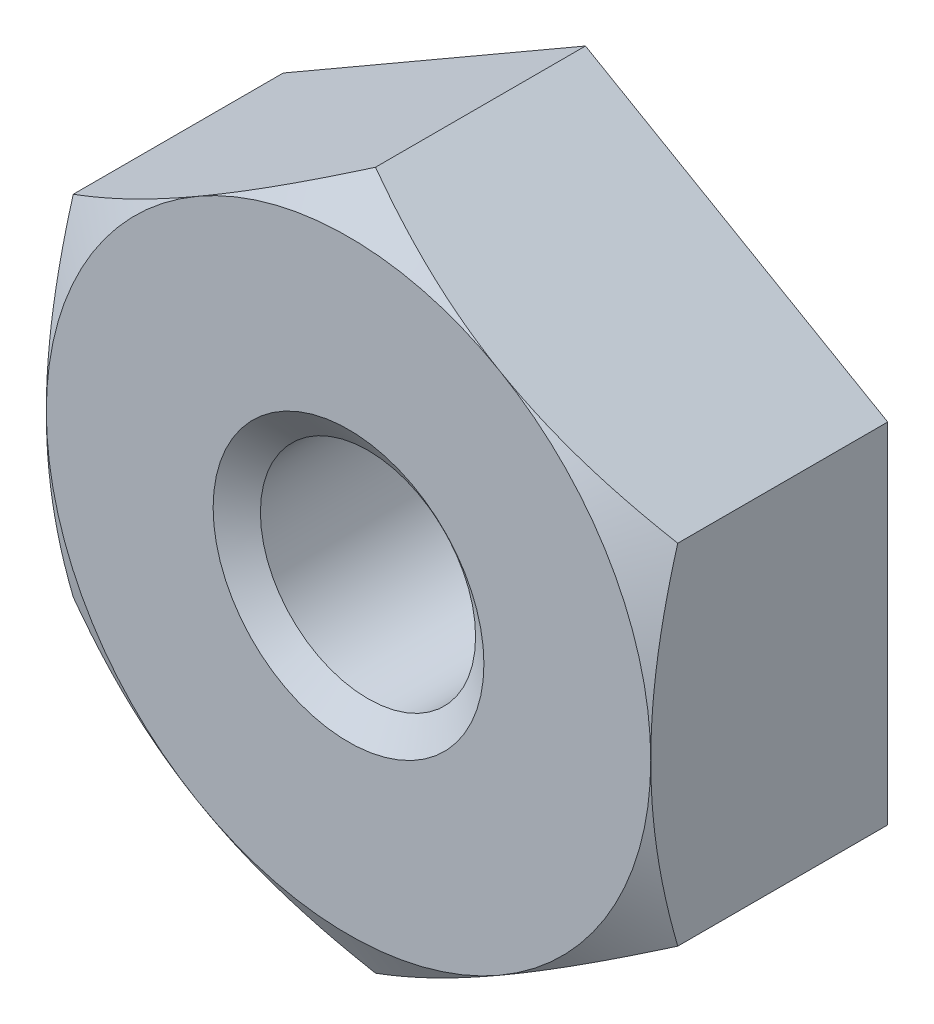
ISO-10303-21;
HEADER;
FILE_DESCRIPTION(('STEP AP214'),'2;1');
FILE_NAME('part.step','',(''),(''),'','','');
FILE_SCHEMA(('AUTOMOTIVE_DESIGN { 1 0 10303 214 1 1 1 1 }'));
ENDSEC;
DATA;
#1=APPLICATION_CONTEXT('core data for automotive mechanical design processes');
#2=APPLICATION_PROTOCOL_DEFINITION('international standard','automotive_design',2000,#1);
#3=PRODUCT_CONTEXT('',#1,'mechanical');
#4=PRODUCT('Part','Part','',(#3));
#5=PRODUCT_RELATED_PRODUCT_CATEGORY('part','',(#4));
#6=PRODUCT_DEFINITION_FORMATION('','',#4);
#7=PRODUCT_DEFINITION_CONTEXT('part definition',#1,'design');
#8=PRODUCT_DEFINITION('design','',#6,#7);
#9=PRODUCT_DEFINITION_SHAPE('','',#8);
#10=(LENGTH_UNIT() NAMED_UNIT(*) SI_UNIT(.MILLI.,.METRE.));
#11=(NAMED_UNIT(*) PLANE_ANGLE_UNIT() SI_UNIT($,.RADIAN.));
#12=(NAMED_UNIT(*) SI_UNIT($,.STERADIAN.) SOLID_ANGLE_UNIT());
#13=UNCERTAINTY_MEASURE_WITH_UNIT(LENGTH_MEASURE(1.E-05),#10,'distance_accuracy_value','');
#14=(GEOMETRIC_REPRESENTATION_CONTEXT(3) GLOBAL_UNCERTAINTY_ASSIGNED_CONTEXT((#13)) GLOBAL_UNIT_ASSIGNED_CONTEXT((#10,
#11,#12)) REPRESENTATION_CONTEXT('',''));
#15=CARTESIAN_POINT('',(0.,0.,0.));
#16=DIRECTION('',(0.,0.,1.));
#17=DIRECTION('',(1.,0.,0.));
#18=AXIS2_PLACEMENT_3D('',#15,#16,#17);
#19=CARTESIAN_POINT('',(0.,0.,-2.4892));
#20=DIRECTION('',(0.,0.,1.));
#21=DIRECTION('',(1.,0.,0.));
#22=AXIS2_PLACEMENT_3D('',#19,#20,#21);
#23=CYLINDRICAL_SURFACE('',#22,1.1303);
#24=CARTESIAN_POINT('',(0.,0.,-0.204530621911059));
#25=DIRECTION('',(0.,0.,1.));
#26=DIRECTION('',(1.,0.,0.));
#27=AXIS2_PLACEMENT_3D('',#24,#25,#26);
#28=CIRCLE('',#27,1.1303);
#29=CARTESIAN_POINT('',(1.1303,0.,-0.204530621911059));
#30=VERTEX_POINT('',#29);
#31=EDGE_CURVE('E131',#30,#30,#28,.F.);
#32=ORIENTED_EDGE('',*,*,#31,.F.);
#33=EDGE_LOOP('',(#32));
#34=FACE_BOUND('',#33,.T.);
#35=CARTESIAN_POINT('',(0.,0.,-2.25926937808894));
#36=DIRECTION('',(0.,0.,-1.));
#37=DIRECTION('',(-1.,0.,0.));
#38=AXIS2_PLACEMENT_3D('',#35,#36,#37);
#39=CIRCLE('',#38,1.1303);
#40=CARTESIAN_POINT('',(-1.1303,0.,-2.25926937808894));
#41=VERTEX_POINT('',#40);
#42=EDGE_CURVE('E37',#41,#41,#39,.F.);
#43=ORIENTED_EDGE('',*,*,#42,.F.);
#44=EDGE_LOOP('',(#43));
#45=FACE_BOUND('',#44,.T.);
#46=ADVANCED_FACE('F32',(#34,#45),#23,.F.);
#47=CARTESIAN_POINT('',(0.,3.66617420935413,-2.4892));
#48=DIRECTION('',(0.,0.,-1.));
#49=DIRECTION('',(-1.,0.,0.));
#50=AXIS2_PLACEMENT_3D('',#47,#48,#49);
#51=PLANE('',#50);
#52=DIRECTION('',(-0.866025403784437,-0.500000000000002,0.));
#53=VECTOR('',#52,1.);
#54=CARTESIAN_POINT('',(0.,3.66617420935413,-2.4892));
#55=LINE('',#54,#53);
#56=CARTESIAN_POINT('',(0.,3.66617420935413,-2.4892));
#57=VERTEX_POINT('',#56);
#58=CARTESIAN_POINT('',(-3.175,1.83308710467706,-2.4892));
#59=VERTEX_POINT('',#58);
#60=EDGE_CURVE('E258',#57,#59,#55,.T.);
#61=ORIENTED_EDGE('',*,*,#60,.F.);
#62=DIRECTION('',(-0.866025403784438,0.500000000000001,0.));
#63=VECTOR('',#62,1.);
#64=CARTESIAN_POINT('',(3.175,1.83308710467706,-2.4892));
#65=LINE('',#64,#63);
#66=CARTESIAN_POINT('',(3.175,1.83308710467706,-2.4892));
#67=VERTEX_POINT('',#66);
#68=EDGE_CURVE('E235',#67,#57,#65,.T.);
#69=ORIENTED_EDGE('',*,*,#68,.F.);
#70=DIRECTION('',(0.,-1.,0.));
#71=VECTOR('',#70,1.);
#72=CARTESIAN_POINT('',(3.175,1.83308710467706,-2.4892));
#73=LINE('',#72,#71);
#74=CARTESIAN_POINT('',(3.175,-1.83308710467707,-2.4892));
#75=VERTEX_POINT('',#74);
#76=EDGE_CURVE('E247',#67,#75,#73,.T.);
#77=ORIENTED_EDGE('',*,*,#76,.T.);
#78=DIRECTION('',(0.866025403784438,0.500000000000002,0.));
#79=VECTOR('',#78,1.);
#80=CARTESIAN_POINT('',(0.,-3.66617420935414,-2.4892));
#81=LINE('',#80,#79);
#82=CARTESIAN_POINT('',(0.,-3.66617420935414,-2.4892));
#83=VERTEX_POINT('',#82);
#84=EDGE_CURVE('E249',#83,#75,#81,.T.);
#85=ORIENTED_EDGE('',*,*,#84,.F.);
#86=DIRECTION('',(0.866025403784438,-0.500000000000001,0.));
#87=VECTOR('',#86,1.);
#88=CARTESIAN_POINT('',(-3.175,-1.83308710467707,-2.4892));
#89=LINE('',#88,#87);
#90=CARTESIAN_POINT('',(-3.175,-1.83308710467707,-2.4892));
#91=VERTEX_POINT('',#90);
#92=EDGE_CURVE('E252',#91,#83,#89,.T.);
#93=ORIENTED_EDGE('',*,*,#92,.F.);
#94=DIRECTION('',(0.,-1.,0.));
#95=VECTOR('',#94,1.);
#96=CARTESIAN_POINT('',(-3.175,1.83308710467706,-2.4892));
#97=LINE('',#96,#95);
#98=EDGE_CURVE('E255',#59,#91,#97,.T.);
#99=ORIENTED_EDGE('',*,*,#98,.F.);
#100=EDGE_LOOP('',(#61,#69,#77,#85,#93,#99));
#101=FACE_BOUND('',#100,.T.);
#102=CARTESIAN_POINT('',(0.,0.,-2.4892));
#103=DIRECTION('',(0.,0.,-1.));
#104=DIRECTION('',(-1.,0.,0.));
#105=AXIS2_PLACEMENT_3D('',#102,#103,#104);
#106=CIRCLE('',#105,1.4224);
#107=CARTESIAN_POINT('',(-1.4224,0.,-2.4892));
#108=VERTEX_POINT('',#107);
#109=EDGE_CURVE('E219',#108,#108,#106,.F.);
#110=ORIENTED_EDGE('',*,*,#109,.T.);
#111=EDGE_LOOP('',(#110));
#112=FACE_BOUND('',#111,.T.);
#113=ADVANCED_FACE('F206',(#101,#112),#51,.T.);
#114=CARTESIAN_POINT('',(0.,3.66617420935413,0.));
#115=DIRECTION('',(0.,0.,-1.));
#116=DIRECTION('',(-1.,0.,0.));
#117=AXIS2_PLACEMENT_3D('',#114,#115,#116);
#118=PLANE('',#117);
#119=CARTESIAN_POINT('',(0.,0.,0.));
#120=DIRECTION('',(0.,0.,-1.));
#121=DIRECTION('',(-1.,0.,0.));
#122=AXIS2_PLACEMENT_3D('',#119,#120,#121);
#123=CIRCLE('',#122,3.175);
#124=CARTESIAN_POINT('',(-1.58750000000001,2.74963065701559,0.));
#125=VERTEX_POINT('',#124);
#126=CARTESIAN_POINT('',(-3.175,0.,0.));
#127=VERTEX_POINT('',#126);
#128=EDGE_CURVE('E44',#125,#127,#123,.F.);
#129=ORIENTED_EDGE('',*,*,#128,.T.);
#130=CARTESIAN_POINT('',(-1.5875,-2.74963065701559,0.));
#131=VERTEX_POINT('',#130);
#132=EDGE_CURVE('E11',#127,#131,#123,.F.);
#133=ORIENTED_EDGE('',*,*,#132,.T.);
#134=CARTESIAN_POINT('',(1.58750000000001,-2.74963065701559,0.));
#135=VERTEX_POINT('',#134);
#136=EDGE_CURVE('E42',#131,#135,#123,.F.);
#137=ORIENTED_EDGE('',*,*,#136,.T.);
#138=CARTESIAN_POINT('',(3.175,0.,0.));
#139=VERTEX_POINT('',#138);
#140=EDGE_CURVE('E110',#135,#139,#123,.F.);
#141=ORIENTED_EDGE('',*,*,#140,.T.);
#142=CARTESIAN_POINT('',(0.,0.,0.));
#143=DIRECTION('',(0.,0.,1.));
#144=DIRECTION('',(1.,0.,0.));
#145=AXIS2_PLACEMENT_3D('',#142,#143,#144);
#146=CIRCLE('',#145,3.175);
#147=CARTESIAN_POINT('',(1.5875,2.74963065701559,0.));
#148=VERTEX_POINT('',#147);
#149=EDGE_CURVE('E122',#139,#148,#146,.T.);
#150=ORIENTED_EDGE('',*,*,#149,.T.);
#151=EDGE_CURVE('E137',#148,#125,#123,.F.);
#152=ORIENTED_EDGE('',*,*,#151,.T.);
#153=EDGE_LOOP('',(#129,#133,#137,#141,#150,#152));
#154=FACE_BOUND('',#153,.T.);
#155=CARTESIAN_POINT('',(0.,0.,0.));
#156=DIRECTION('',(0.,0.,1.));
#157=DIRECTION('',(1.,0.,0.));
#158=AXIS2_PLACEMENT_3D('',#155,#156,#157);
#159=CIRCLE('',#158,1.4224);
#160=CARTESIAN_POINT('',(1.4224,0.,0.));
#161=VERTEX_POINT('',#160);
#162=EDGE_CURVE('E218',#161,#161,#159,.T.);
#163=ORIENTED_EDGE('',*,*,#162,.F.);
#164=EDGE_LOOP('',(#163));
#165=FACE_BOUND('',#164,.T.);
#166=ADVANCED_FACE('F134',(#154,#165),#118,.F.);
#167=CARTESIAN_POINT('',(0.,3.66617420935413,-2.4892));
#168=DIRECTION('',(-0.500000000000002,0.866025403784438,0.));
#169=DIRECTION('',(-0.866025403784438,-0.500000000000002,0.));
#170=AXIS2_PLACEMENT_3D('',#167,#168,#169);
#171=PLANE('',#170);
#172=DIRECTION('',(0.,0.,1.));
#173=VECTOR('',#172,1.);
#174=CARTESIAN_POINT('',(-3.175,1.83308710467706,-2.4892));
#175=LINE('',#174,#173);
#176=CARTESIAN_POINT('',(-3.175,1.83308710467706,-0.283579561989607));
#177=VERTEX_POINT('',#176);
#178=EDGE_CURVE('E231',#59,#177,#175,.T.);
#179=ORIENTED_EDGE('',*,*,#178,.T.);
#180=CARTESIAN_POINT('',(-3.1752,1.83297163462322,-0.283646231805778));
#181=CARTESIAN_POINT('',(-3.03567460326018,1.91352665998974,-0.237119934023207));
#182=CARTESIAN_POINT('',(-2.89494483272887,1.99477703088899,-0.194805864908322));
#183=CARTESIAN_POINT('',(-2.61104837470026,2.15868472735379,-0.120946008708286));
#184=CARTESIAN_POINT('',(-2.46787664251628,2.24134496547055,-0.0894263509090421));
#185=CARTESIAN_POINT('',(-2.18330753500983,2.40564101629246,-0.0403611049832709));
#186=CARTESIAN_POINT('',(-2.0419539457708,2.48725154909053,-0.0224889669031262));
#187=CARTESIAN_POINT('',(-1.75858160224329,2.65085664790703,-0.00115281403229686));
#188=CARTESIAN_POINT('',(-1.61656387803407,2.73285061920892,0.00232886836810175));
#189=CARTESIAN_POINT('',(-1.35119263453263,2.88606277807967,-0.00491170072221306));
#190=CARTESIAN_POINT('',(-1.22779940341379,2.95730389328231,-0.013856146143631));
#191=CARTESIAN_POINT('',(-0.981816852669883,3.09932198517026,-0.0422055763684445));
#192=CARTESIAN_POINT('',(-0.859228383940737,3.17009847059057,-0.0616202467099069));
#193=CARTESIAN_POINT('',(-0.612738605574497,3.31240941048281,-0.110155730811223));
#194=CARTESIAN_POINT('',(-0.488868495421441,3.38392585192423,-0.139482298472806));
#195=CARTESIAN_POINT('',(-0.242975839646995,3.52589204292736,-0.20604219366216));
#196=CARTESIAN_POINT('',(-0.120950143425913,3.59634361148865,-0.243259880449916));
#197=CARTESIAN_POINT('',(0.000199999999999186,3.66628967940796,-0.283646231805781));
#198=B_SPLINE_CURVE_WITH_KNOTS('',3,(#180,#181,#182,#183,#184,#185,#186,#187,#188,#189,#190,
#191,#192,#193,#194,#195,#196,#197),.UNSPECIFIED.,.F.,.F.,(4,2,2,2,2,2,2,2,4),(0.,
0.503278731073368,1.00776724301492,1.49976968502821,1.99116790059651,2.41904879402149,
2.84732618162394,3.28510386250597,3.72202181665389),.UNSPECIFIED.);
#199=EDGE_CURVE('E56',#177,#125,#198,.T.);
#200=ORIENTED_EDGE('',*,*,#199,.T.);
#201=CARTESIAN_POINT('',(0.,3.66617420935413,-0.283579561989607));
#202=VERTEX_POINT('',#201);
#203=EDGE_CURVE('E145',#125,#202,#198,.T.);
#204=ORIENTED_EDGE('',*,*,#203,.T.);
#205=DIRECTION('',(0.,0.,1.));
#206=VECTOR('',#205,1.);
#207=CARTESIAN_POINT('',(0.,3.66617420935413,-2.4892));
#208=LINE('',#207,#206);
#209=EDGE_CURVE('E230',#57,#202,#208,.T.);
#210=ORIENTED_EDGE('',*,*,#209,.F.);
#211=ORIENTED_EDGE('',*,*,#60,.T.);
#212=EDGE_LOOP('',(#179,#200,#204,#210,#211));
#213=FACE_BOUND('',#212,.T.);
#214=ADVANCED_FACE('F34',(#213),#171,.T.);
#215=CARTESIAN_POINT('',(3.175,1.83308710467706,-2.4892));
#216=DIRECTION('',(0.500000000000001,0.866025403784438,0.));
#217=DIRECTION('',(-0.866025403784438,0.500000000000001,0.));
#218=AXIS2_PLACEMENT_3D('',#215,#216,#217);
#219=PLANE('',#218);
#220=ORIENTED_EDGE('',*,*,#209,.T.);
#221=CARTESIAN_POINT('',(-0.000200000000001121,3.66628967940796,-0.283646231805781));
#222=CARTESIAN_POINT('',(0.139325396739818,3.58573465404144,-0.23711993402321));
#223=CARTESIAN_POINT('',(0.280055167271128,3.50448428314219,-0.194805864908325));
#224=CARTESIAN_POINT('',(0.563951625299741,3.34057658667739,-0.120946008708289));
#225=CARTESIAN_POINT('',(0.707123357483717,3.25791634856063,-0.0894263509090441));
#226=CARTESIAN_POINT('',(0.991692464990167,3.09362029773873,-0.0403611049832722));
#227=CARTESIAN_POINT('',(1.1330460542292,3.01200976494065,-0.0224889669031271));
#228=CARTESIAN_POINT('',(1.41641839775671,2.84840466612415,-0.00115281403229733));
#229=CARTESIAN_POINT('',(1.55843612196593,2.76641069482226,0.0023288683681013));
#230=CARTESIAN_POINT('',(1.82380736546737,2.61319853595151,-0.00491170072221313));
#231=CARTESIAN_POINT('',(1.94720059658621,2.54195742074887,-0.0138561461436307));
#232=CARTESIAN_POINT('',(2.19318314733012,2.39993932886093,-0.0422055763684437));
#233=CARTESIAN_POINT('',(2.31577161605926,2.32916284344061,-0.0616202467099058));
#234=CARTESIAN_POINT('',(2.5622613944255,2.18685190354837,-0.110155730811222));
#235=CARTESIAN_POINT('',(2.68613150457856,2.11533546210696,-0.139482298472804));
#236=CARTESIAN_POINT('',(2.93202416035301,1.97336927110383,-0.206042193662158));
#237=CARTESIAN_POINT('',(3.05404985657409,1.90291770254253,-0.243259880449914));
#238=CARTESIAN_POINT('',(3.1752,1.83297163462322,-0.283646231805778));
#239=B_SPLINE_CURVE_WITH_KNOTS('',3,(#221,#222,#223,#224,#225,#226,#227,#228,#229,#230,#231,
#232,#233,#234,#235,#236,#237,#238),.UNSPECIFIED.,.F.,.F.,(4,2,2,2,2,2,2,2,4),(0.,
0.503278731073369,1.00776724301492,1.49976968502821,1.99116790059651,2.41904879402149,
2.84732618162394,3.28510386250597,3.72202181665389),.UNSPECIFIED.);
#240=EDGE_CURVE('E142',#202,#148,#239,.T.);
#241=ORIENTED_EDGE('',*,*,#240,.T.);
#242=CARTESIAN_POINT('',(3.175,1.83308710467707,-0.283579561989607));
#243=VERTEX_POINT('',#242);
#244=EDGE_CURVE('E125',#148,#243,#239,.T.);
#245=ORIENTED_EDGE('',*,*,#244,.T.);
#246=DIRECTION('',(0.,0.,1.));
#247=VECTOR('',#246,1.);
#248=CARTESIAN_POINT('',(3.175,1.83308710467706,-2.4892));
#249=LINE('',#248,#247);
#250=EDGE_CURVE('E141',#67,#243,#249,.T.);
#251=ORIENTED_EDGE('',*,*,#250,.F.);
#252=ORIENTED_EDGE('',*,*,#68,.T.);
#253=EDGE_LOOP('',(#220,#241,#245,#251,#252));
#254=FACE_BOUND('',#253,.T.);
#255=ADVANCED_FACE('F263',(#254),#219,.T.);
#256=CARTESIAN_POINT('',(3.175,1.83308710467706,-2.4892));
#257=DIRECTION('',(-1.,0.,0.));
#258=DIRECTION('',(0.,0.,1.));
#259=AXIS2_PLACEMENT_3D('',#256,#257,#258);
#260=PLANE('',#259);
#261=CARTESIAN_POINT('',(3.175,-4.8616171420299,-1.51932228935976));
#262=CARTESIAN_POINT('',(3.175,-4.7222166877445,-1.45195628992123));
#263=CARTESIAN_POINT('',(3.175,-4.58248664475634,-1.38525996427212));
#264=CARTESIAN_POINT('',(3.175,-4.30218917292502,-1.25358933527025));
#265=CARTESIAN_POINT('',(3.175,-4.16162160419068,-1.18861533006649));
#266=CARTESIAN_POINT('',(3.175,-3.87871153776028,-1.06042973005273));
#267=CARTESIAN_POINT('',(3.175,-3.73636348618431,-0.997230348581289));
#268=CARTESIAN_POINT('',(3.175,-3.4504974070564,-0.873546152177363));
#269=CARTESIAN_POINT('',(3.175,-3.30697944095183,-0.813061195746994));
#270=CARTESIAN_POINT('',(3.175,-3.01676360978826,-0.694809578750527));
#271=CARTESIAN_POINT('',(3.175,-2.87004833678074,-0.637085406846329));
#272=CARTESIAN_POINT('',(3.175,-2.57488727143506,-0.526158008324041));
#273=CARTESIAN_POINT('',(3.175,-2.42644128864792,-0.472955284693414));
#274=CARTESIAN_POINT('',(3.175,-2.12788752613931,-0.372500325317014));
#275=CARTESIAN_POINT('',(3.175,-1.97778404697074,-0.325235438859672));
#276=CARTESIAN_POINT('',(3.175,-1.67544317117207,-0.238191164257203));
#277=CARTESIAN_POINT('',(3.175,-1.52320646578688,-0.198409408930923));
#278=CARTESIAN_POINT('',(3.175,-1.21649515954196,-0.128262693494771));
#279=CARTESIAN_POINT('',(3.175,-1.06201997425122,-0.0979002407280043));
#280=CARTESIAN_POINT('',(3.175,-0.751207163661342,-0.0486364247633605));
#281=CARTESIAN_POINT('',(3.175,-0.594869536715697,-0.0297350716985363));
#282=CARTESIAN_POINT('',(3.175,-0.282140016767181,-0.00506556418736515));
#283=CARTESIAN_POINT('',(3.175,-0.125754853180873,0.000785733729076548));
#284=CARTESIAN_POINT('',(3.175,0.186905967950927,-0.00095572768499411));
#285=CARTESIAN_POINT('',(3.175,0.343181643385311,-0.00854499720968487));
#286=CARTESIAN_POINT('',(3.175,0.610045004210252,-0.0324474955995379));
#287=CARTESIAN_POINT('',(3.175,0.720927103340567,-0.0456480037348537));
#288=CARTESIAN_POINT('',(3.175,0.941834770691507,-0.0779568944626868));
#289=CARTESIAN_POINT('',(3.175,1.05186020102054,-0.097066208790142));
#290=CARTESIAN_POINT('',(3.175,1.38056179828294,-0.162254462566746));
#291=CARTESIAN_POINT('',(3.175,1.59769723107173,-0.216176928599965));
#292=CARTESIAN_POINT('',(3.175,1.92260738330278,-0.30917861020803));
#293=CARTESIAN_POINT('',(3.175,2.03207569486971,-0.342672941312986));
#294=CARTESIAN_POINT('',(3.175,2.24986976286739,-0.412975885555787));
#295=CARTESIAN_POINT('',(3.175,2.35819625057448,-0.449782212723362));
#296=CARTESIAN_POINT('',(3.175,2.57325368409845,-0.525943273724352));
#297=CARTESIAN_POINT('',(3.175,2.67999017870302,-0.565282497316841));
#298=CARTESIAN_POINT('',(3.175,2.89263503540125,-0.64626994332137));
#299=CARTESIAN_POINT('',(3.175,2.99854304277513,-0.687919098952175));
#300=CARTESIAN_POINT('',(3.175,3.1040681107068,-0.730495273942548));
#301=B_SPLINE_CURVE_WITH_KNOTS('',3,(#261,#262,#263,#264,#265,#266,#267,#268,#269,#270,#271,
#272,#273,#274,#275,#276,#277,#278,#279,#280,#281,#282,#283,#284,#285,#286,#287,#288,#289,#290,
#291,#292,#293,#294,#295,#296,#297,#298,#299,#300),.UNSPECIFIED.,.F.,.F.,(4,2,2,2,2,2,2,2,2,2,2,
2,2,2,2,2,2,2,2,4),(0.,0.464480110322491,0.929040108038169,1.39625859500254,1.86345269838581,
2.33638249541753,2.80936483473485,3.28132173853721,3.7531290935448,4.22506193235102,
4.69699518840458,5.16591300646642,5.63470908917535,5.96954086780258,6.30442547160104,
6.97469308766865,7.31809942506291,7.66127053211061,8.00251004161233,8.34388843151022),.UNSPECIFIED.);
#302=CARTESIAN_POINT('',(3.175,-1.83308710467707,-0.283579561989607));
#303=VERTEX_POINT('',#302);
#304=EDGE_CURVE('E106',#303,#139,#301,.T.);
#305=ORIENTED_EDGE('',*,*,#304,.F.);
#306=DIRECTION('',(0.,0.,1.));
#307=VECTOR('',#306,1.);
#308=CARTESIAN_POINT('',(3.175,-1.83308710467707,-2.4892));
#309=LINE('',#308,#307);
#310=EDGE_CURVE('E240',#75,#303,#309,.T.);
#311=ORIENTED_EDGE('',*,*,#310,.F.);
#312=ORIENTED_EDGE('',*,*,#76,.F.);
#313=ORIENTED_EDGE('',*,*,#250,.T.);
#314=EDGE_CURVE('E119',#139,#243,#301,.T.);
#315=ORIENTED_EDGE('',*,*,#314,.F.);
#316=EDGE_LOOP('',(#305,#311,#312,#313,#315));
#317=FACE_BOUND('',#316,.T.);
#318=ADVANCED_FACE('F139',(#317),#260,.F.);
#319=CARTESIAN_POINT('',(0.,-3.66617420935414,-2.4892));
#320=DIRECTION('',(0.500000000000002,-0.866025403784438,0.));
#321=DIRECTION('',(0.866025403784438,0.500000000000002,0.));
#322=AXIS2_PLACEMENT_3D('',#319,#320,#321);
#323=PLANE('',#322);
#324=ORIENTED_EDGE('',*,*,#310,.T.);
#325=CARTESIAN_POINT('',(3.1752,-1.83297163462323,-0.283646231805781));
#326=CARTESIAN_POINT('',(3.03567460326018,-1.91352665998975,-0.23711993402321));
#327=CARTESIAN_POINT('',(2.89494483272887,-1.994777030889,-0.194805864908326));
#328=CARTESIAN_POINT('',(2.61104837470026,-2.1586847273538,-0.12094600870829));
#329=CARTESIAN_POINT('',(2.46787664251628,-2.24134496547057,-0.0894263509090457));
#330=CARTESIAN_POINT('',(2.18330753500983,-2.40564101629247,-0.0403611049832748));
#331=CARTESIAN_POINT('',(2.0419539457708,-2.48725154909054,-0.0224889669031304));
#332=CARTESIAN_POINT('',(1.75858160224329,-2.65085664790704,-0.00115281403230171));
#333=CARTESIAN_POINT('',(1.61656387803407,-2.73285061920894,0.0023288683680965));
#334=CARTESIAN_POINT('',(1.35119263453262,-2.88606277807968,-0.00491170072221867));
#335=CARTESIAN_POINT('',(1.22779940341379,-2.95730389328232,-0.0138561461436366));
#336=CARTESIAN_POINT('',(0.981816852669881,-3.09932198517027,-0.0422055763684503));
#337=CARTESIAN_POINT('',(0.859228383940735,-3.17009847059058,-0.0616202467099128));
#338=CARTESIAN_POINT('',(0.612738605574496,-3.31240941048282,-0.110155730811229));
#339=CARTESIAN_POINT('',(0.488868495421441,-3.38392585192424,-0.139482298472812));
#340=CARTESIAN_POINT('',(0.242975839646995,-3.52589204292737,-0.206042193662165));
#341=CARTESIAN_POINT('',(0.120950143425914,-3.59634361148866,-0.243259880449921));
#342=CARTESIAN_POINT('',(-0.000199999999998958,-3.66628967940797,-0.283646231805786));
#343=B_SPLINE_CURVE_WITH_KNOTS('',3,(#325,#326,#327,#328,#329,#330,#331,#332,#333,#334,#335,
#336,#337,#338,#339,#340,#341,#342),.UNSPECIFIED.,.F.,.F.,(4,2,2,2,2,2,2,2,4),(0.,
0.503278731073368,1.00776724301492,1.49976968502821,1.99116790059651,2.41904879402149,
2.84732618162394,3.28510386250597,3.72202181665389),.UNSPECIFIED.);
#344=EDGE_CURVE('E113',#303,#135,#343,.T.);
#345=ORIENTED_EDGE('',*,*,#344,.T.);
#346=CARTESIAN_POINT('',(0.,-3.66617420935413,-0.283579561989607));
#347=VERTEX_POINT('',#346);
#348=EDGE_CURVE('E152',#135,#347,#343,.T.);
#349=ORIENTED_EDGE('',*,*,#348,.T.);
#350=DIRECTION('',(0.,0.,1.));
#351=VECTOR('',#350,1.);
#352=CARTESIAN_POINT('',(0.,-3.66617420935414,-2.4892));
#353=LINE('',#352,#351);
#354=EDGE_CURVE('E237',#83,#347,#353,.T.);
#355=ORIENTED_EDGE('',*,*,#354,.F.);
#356=ORIENTED_EDGE('',*,*,#84,.T.);
#357=EDGE_LOOP('',(#324,#345,#349,#355,#356));
#358=FACE_BOUND('',#357,.T.);
#359=ADVANCED_FACE('F194',(#358),#323,.T.);
#360=CARTESIAN_POINT('',(-3.175,-1.83308710467707,-2.4892));
#361=DIRECTION('',(-0.500000000000001,-0.866025403784438,0.));
#362=DIRECTION('',(0.866025403784438,-0.500000000000001,0.));
#363=AXIS2_PLACEMENT_3D('',#360,#361,#362);
#364=PLANE('',#363);
#365=ORIENTED_EDGE('',*,*,#354,.T.);
#366=CARTESIAN_POINT('',(0.000200000000000814,-3.66628967940797,-0.283646231805787));
#367=CARTESIAN_POINT('',(-0.139325396739818,-3.58573465404145,-0.237119934023216));
#368=CARTESIAN_POINT('',(-0.280055167271129,-3.5044842831422,-0.194805864908331));
#369=CARTESIAN_POINT('',(-0.563951625299743,-3.3405765866774,-0.120946008708294));
#370=CARTESIAN_POINT('',(-0.70712335748372,-3.25791634856064,-0.089426350909049));
#371=CARTESIAN_POINT('',(-0.99169246499017,-3.09362029773874,-0.0403611049832773));
#372=CARTESIAN_POINT('',(-1.1330460542292,-3.01200976494066,-0.0224889669031325));
#373=CARTESIAN_POINT('',(-1.41641839775671,-2.84840466612416,-0.00115281403230277));
#374=CARTESIAN_POINT('',(-1.55843612196593,-2.76641069482227,0.00232886836809603));
#375=CARTESIAN_POINT('',(-1.82380736546738,-2.61319853595152,-0.00491170072221836));
#376=CARTESIAN_POINT('',(-1.94720059658622,-2.54195742074888,-0.013856146143636));
#377=CARTESIAN_POINT('',(-2.19318314733012,-2.39993932886094,-0.0422055763684489));
#378=CARTESIAN_POINT('',(-2.31577161605927,-2.32916284344062,-0.0616202467099109));
#379=CARTESIAN_POINT('',(-2.56226139442551,-2.18685190354838,-0.110155730811227));
#380=CARTESIAN_POINT('',(-2.68613150457856,-2.11533546210697,-0.139482298472808));
#381=CARTESIAN_POINT('',(-2.93202416035301,-1.97336927110384,-0.206042193662161));
#382=CARTESIAN_POINT('',(-3.05404985657409,-1.90291770254254,-0.243259880449917));
#383=CARTESIAN_POINT('',(-3.1752,-1.83297163462323,-0.283646231805782));
#384=B_SPLINE_CURVE_WITH_KNOTS('',3,(#366,#367,#368,#369,#370,#371,#372,#373,#374,#375,#376,
#377,#378,#379,#380,#381,#382,#383),.UNSPECIFIED.,.F.,.F.,(4,2,2,2,2,2,2,2,4),(0.,
0.50327873107337,1.00776724301493,1.49976968502822,1.99116790059652,2.41904879402149,
2.84732618162394,3.28510386250598,3.72202181665389),.UNSPECIFIED.);
#385=EDGE_CURVE('E188',#347,#131,#384,.T.);
#386=ORIENTED_EDGE('',*,*,#385,.T.);
#387=CARTESIAN_POINT('',(-3.175,-1.83308710467707,-0.283579561989607));
#388=VERTEX_POINT('',#387);
#389=EDGE_CURVE('E181',#131,#388,#384,.T.);
#390=ORIENTED_EDGE('',*,*,#389,.T.);
#391=DIRECTION('',(0.,0.,1.));
#392=VECTOR('',#391,1.);
#393=CARTESIAN_POINT('',(-3.175,-1.83308710467707,-2.4892));
#394=LINE('',#393,#392);
#395=EDGE_CURVE('E234',#91,#388,#394,.T.);
#396=ORIENTED_EDGE('',*,*,#395,.F.);
#397=ORIENTED_EDGE('',*,*,#92,.T.);
#398=EDGE_LOOP('',(#365,#386,#390,#396,#397));
#399=FACE_BOUND('',#398,.T.);
#400=ADVANCED_FACE('F190',(#399),#364,.T.);
#401=CARTESIAN_POINT('',(-3.175,1.83308710467706,-2.4892));
#402=DIRECTION('',(-1.,0.,0.));
#403=DIRECTION('',(0.,0.,1.));
#404=AXIS2_PLACEMENT_3D('',#401,#402,#403);
#405=PLANE('',#404);
#406=ORIENTED_EDGE('',*,*,#395,.T.);
#407=CARTESIAN_POINT('',(-3.175,-4.8616171420299,-1.51932228935976));
#408=CARTESIAN_POINT('',(-3.175,-4.7222166877445,-1.45195628992123));
#409=CARTESIAN_POINT('',(-3.175,-4.58248664475634,-1.38525996427213));
#410=CARTESIAN_POINT('',(-3.175,-4.30218917292502,-1.25358933527025));
#411=CARTESIAN_POINT('',(-3.175,-4.16162160419068,-1.18861533006649));
#412=CARTESIAN_POINT('',(-3.175,-3.87871153776028,-1.06042973005273));
#413=CARTESIAN_POINT('',(-3.175,-3.73636348618432,-0.997230348581291));
#414=CARTESIAN_POINT('',(-3.175,-3.45049740705641,-0.873546152177365));
#415=CARTESIAN_POINT('',(-3.175,-3.30697944095184,-0.813061195746995));
#416=CARTESIAN_POINT('',(-3.175,-3.01676360978827,-0.694809578750529));
#417=CARTESIAN_POINT('',(-3.175,-2.87004833678074,-0.637085406846331));
#418=CARTESIAN_POINT('',(-3.175,-2.57488727143507,-0.526158008324042));
#419=CARTESIAN_POINT('',(-3.175,-2.42644128864793,-0.472955284693415));
#420=CARTESIAN_POINT('',(-3.175,-2.12788752613931,-0.372500325317014));
#421=CARTESIAN_POINT('',(-3.175,-1.97778404697074,-0.325235438859673));
#422=CARTESIAN_POINT('',(-3.175,-1.67544317117207,-0.238191164257204));
#423=CARTESIAN_POINT('',(-3.175,-1.52320646578689,-0.198409408930923));
#424=CARTESIAN_POINT('',(-3.175,-1.21649515954197,-0.128262693494772));
#425=CARTESIAN_POINT('',(-3.175,-1.06201997425122,-0.0979002407280046));
#426=CARTESIAN_POINT('',(-3.175,-0.751207163661344,-0.0486364247633607));
#427=CARTESIAN_POINT('',(-3.175,-0.594869536715699,-0.0297350716985364));
#428=CARTESIAN_POINT('',(-3.175,-0.282140016767183,-0.00506556418736514));
#429=CARTESIAN_POINT('',(-3.175,-0.125754853180875,0.000785733729076502));
#430=CARTESIAN_POINT('',(-3.175,0.186905967950925,-0.000955727684994063));
#431=CARTESIAN_POINT('',(-3.175,0.34318164338531,-0.00854499720968466));
#432=CARTESIAN_POINT('',(-3.175,0.61004500421025,-0.0324474955995377));
#433=CARTESIAN_POINT('',(-3.175,0.720927103340565,-0.0456480037348534));
#434=CARTESIAN_POINT('',(-3.175,0.941834770691505,-0.0779568944626865));
#435=CARTESIAN_POINT('',(-3.175,1.05186020102054,-0.0970662087901415));
#436=CARTESIAN_POINT('',(-3.175,1.38056179828294,-0.162254462566745));
#437=CARTESIAN_POINT('',(-3.175,1.59769723107173,-0.216176928599965));
#438=CARTESIAN_POINT('',(-3.175,1.92260738330278,-0.30917861020803));
#439=CARTESIAN_POINT('',(-3.175,2.03207569486971,-0.342672941312986));
#440=CARTESIAN_POINT('',(-3.175,2.24986976286739,-0.412975885555786));
#441=CARTESIAN_POINT('',(-3.175,2.35819625057448,-0.449782212723361));
#442=CARTESIAN_POINT('',(-3.175,2.57325368409845,-0.525943273724352));
#443=CARTESIAN_POINT('',(-3.175,2.67999017870302,-0.56528249731684));
#444=CARTESIAN_POINT('',(-3.175,2.89263503540125,-0.646269943321369));
#445=CARTESIAN_POINT('',(-3.175,2.99854304277513,-0.687919098952173));
#446=CARTESIAN_POINT('',(-3.175,3.1040681107068,-0.730495273942547));
#447=B_SPLINE_CURVE_WITH_KNOTS('',3,(#407,#408,#409,#410,#411,#412,#413,#414,#415,#416,#417,
#418,#419,#420,#421,#422,#423,#424,#425,#426,#427,#428,#429,#430,#431,#432,#433,#434,#435,#436,
#437,#438,#439,#440,#441,#442,#443,#444,#445,#446),.UNSPECIFIED.,.F.,.F.,(4,2,2,2,2,2,2,2,2,2,2,
2,2,2,2,2,2,2,2,4),(0.,0.46448011032249,0.929040108038168,1.39625859500254,1.86345269838581,
2.33638249541753,2.80936483473484,3.2813217385372,3.7531290935448,4.22506193235102,
4.69699518840458,5.16591300646642,5.63470908917535,5.96954086780258,6.30442547160104,
6.97469308766865,7.31809942506291,7.66127053211061,8.00251004161233,8.34388843151022),.UNSPECIFIED.);
#448=EDGE_CURVE('E189',#388,#127,#447,.T.);
#449=ORIENTED_EDGE('',*,*,#448,.T.);
#450=EDGE_CURVE('E130',#127,#177,#447,.T.);
#451=ORIENTED_EDGE('',*,*,#450,.T.);
#452=ORIENTED_EDGE('',*,*,#178,.F.);
#453=ORIENTED_EDGE('',*,*,#98,.T.);
#454=EDGE_LOOP('',(#406,#449,#451,#452,#453));
#455=FACE_BOUND('',#454,.T.);
#456=ADVANCED_FACE('F193',(#455),#405,.T.);
#457=CARTESIAN_POINT('',(0.,0.,0.));
#458=DIRECTION('',(0.,0.,-1.));
#459=DIRECTION('',(-1.,0.,0.));
#460=AXIS2_PLACEMENT_3D('',#457,#458,#459);
#461=CONICAL_SURFACE('',#460,3.175,1.0471975511966);
#462=ORIENTED_EDGE('',*,*,#450,.F.);
#463=ORIENTED_EDGE('',*,*,#128,.F.);
#464=ORIENTED_EDGE('',*,*,#199,.F.);
#465=EDGE_LOOP('',(#462,#463,#464));
#466=FACE_BOUND('',#465,.T.);
#467=ADVANCED_FACE('F199',(#466),#461,.T.);
#468=ORIENTED_EDGE('',*,*,#151,.F.);
#469=ORIENTED_EDGE('',*,*,#240,.F.);
#470=ORIENTED_EDGE('',*,*,#203,.F.);
#471=EDGE_LOOP('',(#468,#469,#470));
#472=FACE_BOUND('',#471,.T.);
#473=ADVANCED_FACE('F170',(#472),#461,.T.);
#474=ORIENTED_EDGE('',*,*,#149,.F.);
#475=ORIENTED_EDGE('',*,*,#314,.T.);
#476=ORIENTED_EDGE('',*,*,#244,.F.);
#477=EDGE_LOOP('',(#474,#475,#476));
#478=FACE_BOUND('',#477,.T.);
#479=ADVANCED_FACE('F123',(#478),#461,.T.);
#480=ORIENTED_EDGE('',*,*,#304,.T.);
#481=ORIENTED_EDGE('',*,*,#140,.F.);
#482=ORIENTED_EDGE('',*,*,#344,.F.);
#483=EDGE_LOOP('',(#480,#481,#482));
#484=FACE_BOUND('',#483,.T.);
#485=ADVANCED_FACE('F108',(#484),#461,.T.);
#486=ORIENTED_EDGE('',*,*,#136,.F.);
#487=ORIENTED_EDGE('',*,*,#385,.F.);
#488=ORIENTED_EDGE('',*,*,#348,.F.);
#489=EDGE_LOOP('',(#486,#487,#488));
#490=FACE_BOUND('',#489,.T.);
#491=ADVANCED_FACE('F169',(#490),#461,.T.);
#492=ORIENTED_EDGE('',*,*,#132,.F.);
#493=ORIENTED_EDGE('',*,*,#448,.F.);
#494=ORIENTED_EDGE('',*,*,#389,.F.);
#495=EDGE_LOOP('',(#492,#493,#494));
#496=FACE_BOUND('',#495,.T.);
#497=ADVANCED_FACE('F163',(#496),#461,.T.);
#498=CARTESIAN_POINT('',(0.,0.,-0.224983684102165));
#499=DIRECTION('',(0.,0.,1.));
#500=DIRECTION('',(1.,0.,0.));
#501=AXIS2_PLACEMENT_3D('',#498,#499,#500);
#502=CONICAL_SURFACE('',#501,1.10109,0.959931088596874);
#503=ORIENTED_EDGE('',*,*,#162,.T.);
#504=EDGE_LOOP('',(#503));
#505=FACE_BOUND('',#504,.T.);
#506=ORIENTED_EDGE('',*,*,#31,.T.);
#507=EDGE_LOOP('',(#506));
#508=FACE_BOUND('',#507,.T.);
#509=ADVANCED_FACE('F168',(#505,#508),#502,.F.);
#510=CARTESIAN_POINT('',(0.,0.,-2.4638));
#511=DIRECTION('',(0.,0.,-1.));
#512=DIRECTION('',(-1.,0.,0.));
#513=AXIS2_PLACEMENT_3D('',#510,#511,#512);
#514=CONICAL_SURFACE('',#513,1.4224,0.959931088596882);
#515=CARTESIAN_POINT('',(0.,0.,-2.4638));
#516=DIRECTION('',(0.,0.,1.));
#517=DIRECTION('',(1.,0.,0.));
#518=AXIS2_PLACEMENT_3D('',#515,#516,#517);
#519=CIRCLE('',#518,1.4224);
#520=CARTESIAN_POINT('',(1.4224,0.,-2.4638));
#521=VERTEX_POINT('',#520);
#522=EDGE_CURVE('E223',#521,#521,#519,.T.);
#523=ORIENTED_EDGE('',*,*,#522,.F.);
#524=EDGE_LOOP('',(#523));
#525=FACE_BOUND('',#524,.T.);
#526=ORIENTED_EDGE('',*,*,#42,.T.);
#527=EDGE_LOOP('',(#526));
#528=FACE_BOUND('',#527,.T.);
#529=ADVANCED_FACE('F309',(#525,#528),#514,.F.);
#530=CARTESIAN_POINT('',(0.,0.,-25.0375057290932));
#531=DIRECTION('',(0.,0.,1.));
#532=DIRECTION('',(1.,0.,0.));
#533=AXIS2_PLACEMENT_3D('',#530,#531,#532);
#534=CYLINDRICAL_SURFACE('',#533,1.4224);
#535=ORIENTED_EDGE('',*,*,#109,.F.);
#536=EDGE_LOOP('',(#535));
#537=FACE_BOUND('',#536,.T.);
#538=ORIENTED_EDGE('',*,*,#522,.T.);
#539=EDGE_LOOP('',(#538));
#540=FACE_BOUND('',#539,.T.);
#541=ADVANCED_FACE('F316',(#537,#540),#534,.F.);
#542=CLOSED_SHELL('',(#46,#113,#166,#214,#255,#318,#359,#400,#456,#467,#473,#479,#485,#491,#497,
#509,#529,#541));
#543=MANIFOLD_SOLID_BREP('B2',#542);
#544=ADVANCED_BREP_SHAPE_REPRESENTATION('',(#18,#543),#14);
#545=SHAPE_DEFINITION_REPRESENTATION(#9,#544);
ENDSEC;
END-ISO-10303-21;
